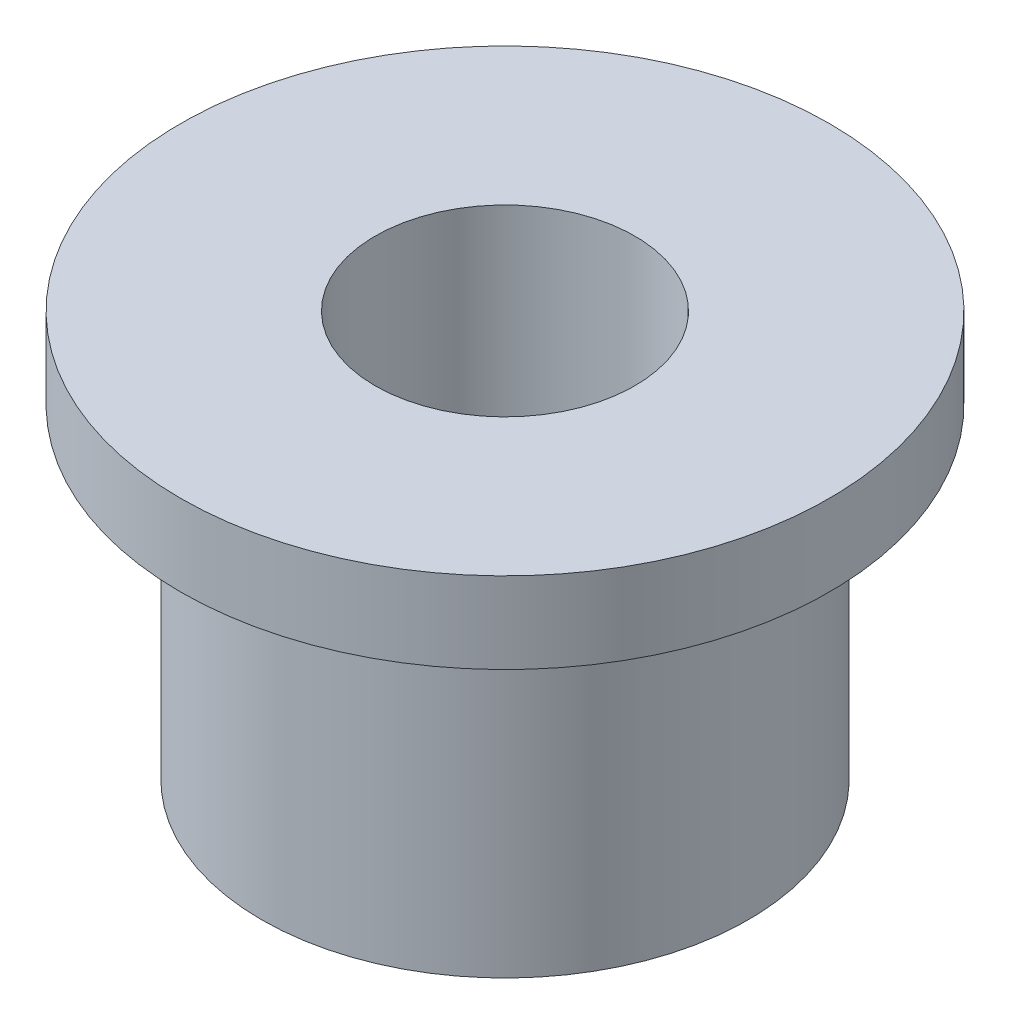
ISO-10303-21;
HEADER;
FILE_DESCRIPTION(('STEP AP214'),'2;1');
FILE_NAME('part.step','',(''),(''),'','','');
FILE_SCHEMA(('AUTOMOTIVE_DESIGN { 1 0 10303 214 1 1 1 1 }'));
ENDSEC;
DATA;
#1=APPLICATION_CONTEXT('core data for automotive mechanical design processes');
#2=APPLICATION_PROTOCOL_DEFINITION('international standard','automotive_design',2000,#1);
#3=PRODUCT_CONTEXT('',#1,'mechanical');
#4=PRODUCT('Part','Part','',(#3));
#5=PRODUCT_RELATED_PRODUCT_CATEGORY('part','',(#4));
#6=PRODUCT_DEFINITION_FORMATION('','',#4);
#7=PRODUCT_DEFINITION_CONTEXT('part definition',#1,'design');
#8=PRODUCT_DEFINITION('design','',#6,#7);
#9=PRODUCT_DEFINITION_SHAPE('','',#8);
#10=(LENGTH_UNIT() NAMED_UNIT(*) SI_UNIT(.MILLI.,.METRE.));
#11=(NAMED_UNIT(*) PLANE_ANGLE_UNIT() SI_UNIT($,.RADIAN.));
#12=(NAMED_UNIT(*) SI_UNIT($,.STERADIAN.) SOLID_ANGLE_UNIT());
#13=UNCERTAINTY_MEASURE_WITH_UNIT(LENGTH_MEASURE(1.E-05),#10,'distance_accuracy_value','');
#14=(GEOMETRIC_REPRESENTATION_CONTEXT(3) GLOBAL_UNCERTAINTY_ASSIGNED_CONTEXT((#13)) GLOBAL_UNIT_ASSIGNED_CONTEXT((#10,
#11,#12)) REPRESENTATION_CONTEXT('',''));
#15=CARTESIAN_POINT('',(0.,0.,0.));
#16=DIRECTION('',(0.,0.,1.));
#17=DIRECTION('',(1.,0.,0.));
#18=AXIS2_PLACEMENT_3D('',#15,#16,#17);
#19=CARTESIAN_POINT('',(0.,5.,0.));
#20=DIRECTION('',(0.,-1.,0.));
#21=DIRECTION('',(0.,0.,-1.));
#22=AXIS2_PLACEMENT_3D('',#19,#20,#21);
#23=CYLINDRICAL_SURFACE('',#22,3.);
#24=CARTESIAN_POINT('',(0.,0.,0.));
#25=DIRECTION('',(0.,1.,0.));
#26=DIRECTION('',(0.,0.,1.));
#27=AXIS2_PLACEMENT_3D('',#24,#25,#26);
#28=CIRCLE('',#27,3.);
#29=CARTESIAN_POINT('',(0.,0.,3.));
#30=VERTEX_POINT('',#29);
#31=EDGE_CURVE('E48',#30,#30,#28,.T.);
#32=ORIENTED_EDGE('',*,*,#31,.T.);
#33=EDGE_LOOP('',(#32));
#34=FACE_BOUND('',#33,.T.);
#35=CARTESIAN_POINT('',(0.,4.,0.));
#36=DIRECTION('',(0.,1.,0.));
#37=DIRECTION('',(0.,0.,1.));
#38=AXIS2_PLACEMENT_3D('',#35,#36,#37);
#39=CIRCLE('',#38,3.);
#40=CARTESIAN_POINT('',(0.,4.,3.));
#41=VERTEX_POINT('',#40);
#42=EDGE_CURVE('E10',#41,#41,#39,.T.);
#43=ORIENTED_EDGE('',*,*,#42,.F.);
#44=EDGE_LOOP('',(#43));
#45=FACE_BOUND('',#44,.T.);
#46=ADVANCED_FACE('F41',(#34,#45),#23,.T.);
#47=CARTESIAN_POINT('',(0.,5.,0.));
#48=DIRECTION('',(0.,1.,0.));
#49=DIRECTION('',(0.,0.,1.));
#50=AXIS2_PLACEMENT_3D('',#47,#48,#49);
#51=PLANE('',#50);
#52=CARTESIAN_POINT('',(0.,5.,0.));
#53=DIRECTION('',(0.,1.,0.));
#54=DIRECTION('',(0.,0.,1.));
#55=AXIS2_PLACEMENT_3D('',#52,#53,#54);
#56=CIRCLE('',#55,1.6);
#57=CARTESIAN_POINT('',(0.,5.,1.6));
#58=VERTEX_POINT('',#57);
#59=EDGE_CURVE('E53',#58,#58,#56,.T.);
#60=ORIENTED_EDGE('',*,*,#59,.F.);
#61=EDGE_LOOP('',(#60));
#62=FACE_BOUND('',#61,.T.);
#63=CARTESIAN_POINT('',(0.,5.,0.));
#64=DIRECTION('',(0.,1.,0.));
#65=DIRECTION('',(0.,0.,1.));
#66=AXIS2_PLACEMENT_3D('',#63,#64,#65);
#67=CIRCLE('',#66,4.);
#68=CARTESIAN_POINT('',(0.,5.,4.));
#69=VERTEX_POINT('',#68);
#70=EDGE_CURVE('E65',#69,#69,#67,.T.);
#71=ORIENTED_EDGE('',*,*,#70,.T.);
#72=EDGE_LOOP('',(#71));
#73=FACE_BOUND('',#72,.T.);
#74=ADVANCED_FACE('F85',(#62,#73),#51,.T.);
#75=CARTESIAN_POINT('',(0.,0.,0.));
#76=DIRECTION('',(0.,1.,0.));
#77=DIRECTION('',(0.,0.,1.));
#78=AXIS2_PLACEMENT_3D('',#75,#76,#77);
#79=PLANE('',#78);
#80=ORIENTED_EDGE('',*,*,#31,.F.);
#81=EDGE_LOOP('',(#80));
#82=FACE_BOUND('',#81,.T.);
#83=CARTESIAN_POINT('',(0.,0.,0.));
#84=DIRECTION('',(0.,1.,0.));
#85=DIRECTION('',(0.,0.,1.));
#86=AXIS2_PLACEMENT_3D('',#83,#84,#85);
#87=CIRCLE('',#86,1.6);
#88=CARTESIAN_POINT('',(0.,0.,1.6));
#89=VERTEX_POINT('',#88);
#90=EDGE_CURVE('E58',#89,#89,#87,.T.);
#91=ORIENTED_EDGE('',*,*,#90,.T.);
#92=EDGE_LOOP('',(#91));
#93=FACE_BOUND('',#92,.T.);
#94=ADVANCED_FACE('F89',(#82,#93),#79,.F.);
#95=CARTESIAN_POINT('',(0.,5.,0.));
#96=DIRECTION('',(0.,-1.,0.));
#97=DIRECTION('',(0.,0.,-1.));
#98=AXIS2_PLACEMENT_3D('',#95,#96,#97);
#99=CYLINDRICAL_SURFACE('',#98,1.6);
#100=ORIENTED_EDGE('',*,*,#59,.T.);
#101=EDGE_LOOP('',(#100));
#102=FACE_BOUND('',#101,.T.);
#103=ORIENTED_EDGE('',*,*,#90,.F.);
#104=EDGE_LOOP('',(#103));
#105=FACE_BOUND('',#104,.T.);
#106=ADVANCED_FACE('F82',(#102,#105),#99,.F.);
#107=CARTESIAN_POINT('',(0.,4.,0.));
#108=DIRECTION('',(0.,1.,0.));
#109=DIRECTION('',(0.,0.,1.));
#110=AXIS2_PLACEMENT_3D('',#107,#108,#109);
#111=CYLINDRICAL_SURFACE('',#110,4.);
#112=CARTESIAN_POINT('',(0.,4.,0.));
#113=DIRECTION('',(0.,1.,0.));
#114=DIRECTION('',(0.,0.,1.));
#115=AXIS2_PLACEMENT_3D('',#112,#113,#114);
#116=CIRCLE('',#115,4.);
#117=CARTESIAN_POINT('',(0.,4.,4.));
#118=VERTEX_POINT('',#117);
#119=EDGE_CURVE('E63',#118,#118,#116,.T.);
#120=ORIENTED_EDGE('',*,*,#119,.T.);
#121=EDGE_LOOP('',(#120));
#122=FACE_BOUND('',#121,.T.);
#123=ORIENTED_EDGE('',*,*,#70,.F.);
#124=EDGE_LOOP('',(#123));
#125=FACE_BOUND('',#124,.T.);
#126=ADVANCED_FACE('F73',(#122,#125),#111,.T.);
#127=CARTESIAN_POINT('',(0.,4.,0.));
#128=DIRECTION('',(0.,1.,0.));
#129=DIRECTION('',(0.,0.,1.));
#130=AXIS2_PLACEMENT_3D('',#127,#128,#129);
#131=PLANE('',#130);
#132=ORIENTED_EDGE('',*,*,#42,.T.);
#133=EDGE_LOOP('',(#132));
#134=FACE_BOUND('',#133,.T.);
#135=ORIENTED_EDGE('',*,*,#119,.F.);
#136=EDGE_LOOP('',(#135));
#137=FACE_BOUND('',#136,.T.);
#138=ADVANCED_FACE('F76',(#134,#137),#131,.F.);
#139=CLOSED_SHELL('',(#46,#74,#94,#106,#126,#138));
#140=MANIFOLD_SOLID_BREP('B2',#139);
#141=ADVANCED_BREP_SHAPE_REPRESENTATION('',(#18,#140),#14);
#142=SHAPE_DEFINITION_REPRESENTATION(#9,#141);
ENDSEC;
END-ISO-10303-21;
